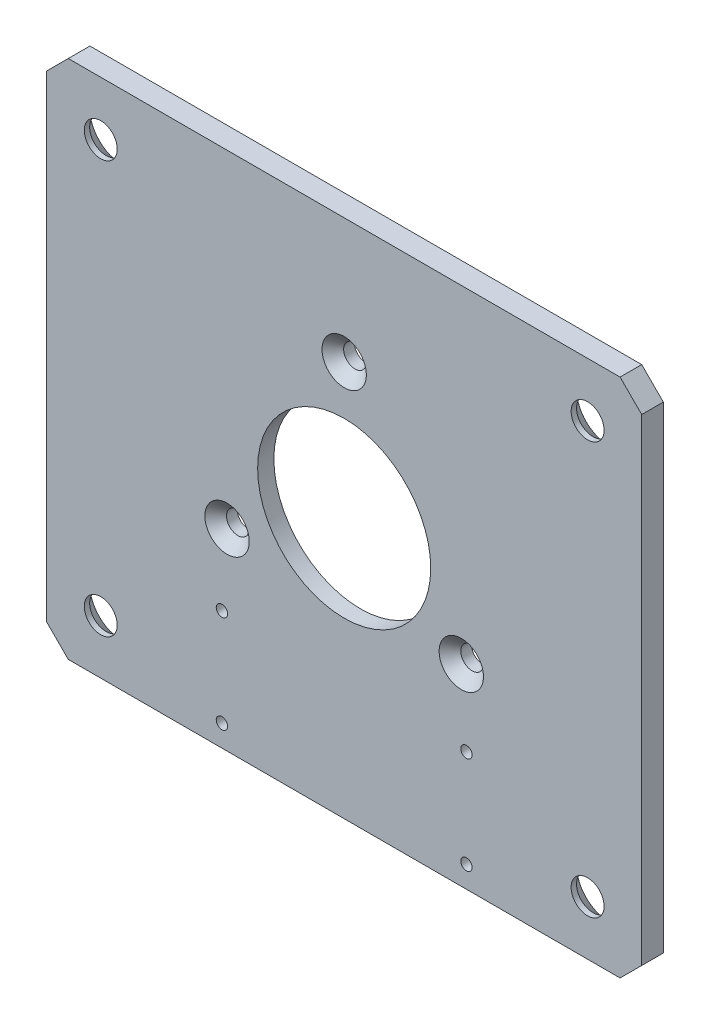
ISO-10303-21;
HEADER;
FILE_DESCRIPTION(('STEP AP214'),'2;1');
FILE_NAME('part.step','',(''),(''),'','','');
FILE_SCHEMA(('AUTOMOTIVE_DESIGN { 1 0 10303 214 1 1 1 1 }'));
ENDSEC;
DATA;
#1=APPLICATION_CONTEXT('core data for automotive mechanical design processes');
#2=APPLICATION_PROTOCOL_DEFINITION('international standard','automotive_design',2000,#1);
#3=PRODUCT_CONTEXT('',#1,'mechanical');
#4=PRODUCT('Part','Part','',(#3));
#5=PRODUCT_RELATED_PRODUCT_CATEGORY('part','',(#4));
#6=PRODUCT_DEFINITION_FORMATION('','',#4);
#7=PRODUCT_DEFINITION_CONTEXT('part definition',#1,'design');
#8=PRODUCT_DEFINITION('design','',#6,#7);
#9=PRODUCT_DEFINITION_SHAPE('','',#8);
#10=(LENGTH_UNIT() NAMED_UNIT(*) SI_UNIT(.MILLI.,.METRE.));
#11=(NAMED_UNIT(*) PLANE_ANGLE_UNIT() SI_UNIT($,.RADIAN.));
#12=(NAMED_UNIT(*) SI_UNIT($,.STERADIAN.) SOLID_ANGLE_UNIT());
#13=UNCERTAINTY_MEASURE_WITH_UNIT(LENGTH_MEASURE(1.E-05),#10,'distance_accuracy_value','');
#14=(GEOMETRIC_REPRESENTATION_CONTEXT(3) GLOBAL_UNCERTAINTY_ASSIGNED_CONTEXT((#13)) GLOBAL_UNIT_ASSIGNED_CONTEXT((#10,
#11,#12)) REPRESENTATION_CONTEXT('',''));
#15=CARTESIAN_POINT('',(0.,0.,0.));
#16=DIRECTION('',(0.,0.,1.));
#17=DIRECTION('',(1.,0.,0.));
#18=AXIS2_PLACEMENT_3D('',#15,#16,#17);
#19=CARTESIAN_POINT('',(0.,0.,2.));
#20=DIRECTION('',(0.,0.,-1.));
#21=DIRECTION('',(-1.,0.,0.));
#22=AXIS2_PLACEMENT_3D('',#19,#20,#21);
#23=CYLINDRICAL_SURFACE('',#22,16.);
#24=CARTESIAN_POINT('',(0.,0.,2.));
#25=DIRECTION('',(0.,0.,1.));
#26=DIRECTION('',(1.,0.,0.));
#27=AXIS2_PLACEMENT_3D('',#24,#25,#26);
#28=CIRCLE('',#27,16.);
#29=CARTESIAN_POINT('',(16.,0.,2.));
#30=VERTEX_POINT('',#29);
#31=EDGE_CURVE('E196',#30,#30,#28,.T.);
#32=ORIENTED_EDGE('',*,*,#31,.T.);
#33=EDGE_LOOP('',(#32));
#34=FACE_BOUND('',#33,.T.);
#35=CARTESIAN_POINT('',(0.,0.,-1.));
#36=DIRECTION('',(0.,0.,-1.));
#37=DIRECTION('',(-1.,0.,0.));
#38=AXIS2_PLACEMENT_3D('',#35,#36,#37);
#39=CIRCLE('',#38,16.);
#40=CARTESIAN_POINT('',(-16.,0.,-1.));
#41=VERTEX_POINT('',#40);
#42=EDGE_CURVE('E193',#41,#41,#39,.T.);
#43=ORIENTED_EDGE('',*,*,#42,.T.);
#44=EDGE_LOOP('',(#43));
#45=FACE_BOUND('',#44,.T.);
#46=ADVANCED_FACE('F37',(#34,#45),#23,.F.);
#47=CARTESIAN_POINT('',(0.,0.,2.));
#48=DIRECTION('',(0.,0.,1.));
#49=DIRECTION('',(1.,0.,0.));
#50=AXIS2_PLACEMENT_3D('',#47,#48,#49);
#51=PLANE('',#50);
#52=CARTESIAN_POINT('',(-22.6,-44.1,2.));
#53=DIRECTION('',(0.,0.,-1.));
#54=DIRECTION('',(-1.,0.,0.));
#55=AXIS2_PLACEMENT_3D('',#52,#53,#54);
#56=CIRCLE('',#55,1.05);
#57=CARTESIAN_POINT('',(-23.65,-44.1,2.));
#58=VERTEX_POINT('',#57);
#59=EDGE_CURVE('E633',#58,#58,#56,.T.);
#60=ORIENTED_EDGE('',*,*,#59,.T.);
#61=EDGE_LOOP('',(#60));
#62=FACE_BOUND('',#61,.T.);
#63=CARTESIAN_POINT('',(-22.6,-26.1,2.));
#64=DIRECTION('',(0.,0.,-1.));
#65=DIRECTION('',(-1.,0.,0.));
#66=AXIS2_PLACEMENT_3D('',#63,#64,#65);
#67=CIRCLE('',#66,1.05);
#68=CARTESIAN_POINT('',(-23.65,-26.1,2.));
#69=VERTEX_POINT('',#68);
#70=EDGE_CURVE('E624',#69,#69,#67,.T.);
#71=ORIENTED_EDGE('',*,*,#70,.T.);
#72=EDGE_LOOP('',(#71));
#73=FACE_BOUND('',#72,.T.);
#74=CARTESIAN_POINT('',(22.6,-26.1,2.));
#75=DIRECTION('',(0.,0.,-1.));
#76=DIRECTION('',(-1.,0.,0.));
#77=AXIS2_PLACEMENT_3D('',#74,#75,#76);
#78=CIRCLE('',#77,1.05);
#79=CARTESIAN_POINT('',(21.55,-26.1,2.));
#80=VERTEX_POINT('',#79);
#81=EDGE_CURVE('E619',#80,#80,#78,.T.);
#82=ORIENTED_EDGE('',*,*,#81,.T.);
#83=EDGE_LOOP('',(#82));
#84=FACE_BOUND('',#83,.T.);
#85=CARTESIAN_POINT('',(22.6,-44.1,2.));
#86=DIRECTION('',(0.,0.,-1.));
#87=DIRECTION('',(-1.,0.,0.));
#88=AXIS2_PLACEMENT_3D('',#85,#86,#87);
#89=CIRCLE('',#88,1.05);
#90=CARTESIAN_POINT('',(21.55,-44.1,2.));
#91=VERTEX_POINT('',#90);
#92=EDGE_CURVE('E384',#91,#91,#89,.T.);
#93=ORIENTED_EDGE('',*,*,#92,.T.);
#94=EDGE_LOOP('',(#93));
#95=FACE_BOUND('',#94,.T.);
#96=CARTESIAN_POINT('',(21.6506350946111,-12.4999999999998,2.));
#97=DIRECTION('',(0.,0.,1.));
#98=DIRECTION('',(1.,0.,0.));
#99=AXIS2_PLACEMENT_3D('',#96,#97,#98);
#100=CIRCLE('',#99,4.09999999999998);
#101=CARTESIAN_POINT('',(25.7506350946111,-12.4999999999998,2.));
#102=VERTEX_POINT('',#101);
#103=EDGE_CURVE('E203',#102,#102,#100,.F.);
#104=ORIENTED_EDGE('',*,*,#103,.T.);
#105=EDGE_LOOP('',(#104));
#106=FACE_BOUND('',#105,.T.);
#107=CARTESIAN_POINT('',(-21.6506350946109,-12.5000000000001,2.));
#108=DIRECTION('',(0.,0.,1.));
#109=DIRECTION('',(1.,0.,0.));
#110=AXIS2_PLACEMENT_3D('',#107,#108,#109);
#111=CIRCLE('',#110,4.10000000000001);
#112=CARTESIAN_POINT('',(-17.5506350946109,-12.5000000000001,2.));
#113=VERTEX_POINT('',#112);
#114=EDGE_CURVE('E200',#113,#113,#111,.F.);
#115=ORIENTED_EDGE('',*,*,#114,.T.);
#116=EDGE_LOOP('',(#115));
#117=FACE_BOUND('',#116,.T.);
#118=CARTESIAN_POINT('',(0.,25.,2.));
#119=DIRECTION('',(0.,0.,1.));
#120=DIRECTION('',(1.,0.,0.));
#121=AXIS2_PLACEMENT_3D('',#118,#119,#120);
#122=CIRCLE('',#121,4.09999999999997);
#123=CARTESIAN_POINT('',(4.09999999999997,25.,2.));
#124=VERTEX_POINT('',#123);
#125=EDGE_CURVE('E192',#124,#124,#122,.F.);
#126=ORIENTED_EDGE('',*,*,#125,.T.);
#127=EDGE_LOOP('',(#126));
#128=FACE_BOUND('',#127,.T.);
#129=CARTESIAN_POINT('',(45.,38.1,2.));
#130=DIRECTION('',(0.,0.,1.));
#131=DIRECTION('',(1.,0.,0.));
#132=AXIS2_PLACEMENT_3D('',#129,#130,#131);
#133=CIRCLE('',#132,3.05);
#134=CARTESIAN_POINT('',(48.05,38.1,2.));
#135=VERTEX_POINT('',#134);
#136=EDGE_CURVE('E230',#135,#135,#133,.T.);
#137=ORIENTED_EDGE('',*,*,#136,.F.);
#138=EDGE_LOOP('',(#137));
#139=FACE_BOUND('',#138,.T.);
#140=CARTESIAN_POINT('',(-45.,-38.1,2.));
#141=DIRECTION('',(0.,0.,1.));
#142=DIRECTION('',(1.,0.,0.));
#143=AXIS2_PLACEMENT_3D('',#140,#141,#142);
#144=CIRCLE('',#143,3.05);
#145=CARTESIAN_POINT('',(-41.95,-38.1,2.));
#146=VERTEX_POINT('',#145);
#147=EDGE_CURVE('E233',#146,#146,#144,.T.);
#148=ORIENTED_EDGE('',*,*,#147,.F.);
#149=EDGE_LOOP('',(#148));
#150=FACE_BOUND('',#149,.T.);
#151=DIRECTION('',(0.,-1.,0.));
#152=VECTOR('',#151,1.);
#153=CARTESIAN_POINT('',(-55.,-48.1,2.));
#154=LINE('',#153,#152);
#155=CARTESIAN_POINT('',(-55.,44.1,2.));
#156=VERTEX_POINT('',#155);
#157=CARTESIAN_POINT('',(-55.,-44.1,2.));
#158=VERTEX_POINT('',#157);
#159=EDGE_CURVE('E142',#156,#158,#154,.T.);
#160=ORIENTED_EDGE('',*,*,#159,.T.);
#161=DIRECTION('',(-0.707106781186546,0.707106781186549,0.));
#162=VECTOR('',#161,1.);
#163=CARTESIAN_POINT('',(-49.5500000000001,-49.5499999999999,2.));
#164=LINE('',#163,#162);
#165=CARTESIAN_POINT('',(-51.,-48.1,2.));
#166=VERTEX_POINT('',#165);
#167=EDGE_CURVE('E157',#158,#166,#164,.F.);
#168=ORIENTED_EDGE('',*,*,#167,.T.);
#169=DIRECTION('',(1.,0.,0.));
#170=VECTOR('',#169,1.);
#171=CARTESIAN_POINT('',(55.,-48.1,2.));
#172=LINE('',#171,#170);
#173=CARTESIAN_POINT('',(51.,-48.1,2.));
#174=VERTEX_POINT('',#173);
#175=EDGE_CURVE('E125',#166,#174,#172,.T.);
#176=ORIENTED_EDGE('',*,*,#175,.T.);
#177=DIRECTION('',(-0.70710678118655,-0.707106781186545,0.));
#178=VECTOR('',#177,1.);
#179=CARTESIAN_POINT('',(49.5499999999998,-49.5500000000002,2.));
#180=LINE('',#179,#178);
#181=CARTESIAN_POINT('',(55.,-44.1,2.));
#182=VERTEX_POINT('',#181);
#183=EDGE_CURVE('E155',#174,#182,#180,.F.);
#184=ORIENTED_EDGE('',*,*,#183,.T.);
#185=DIRECTION('',(0.,1.,0.));
#186=VECTOR('',#185,1.);
#187=CARTESIAN_POINT('',(55.,-48.1,2.));
#188=LINE('',#187,#186);
#189=CARTESIAN_POINT('',(55.,44.1,2.));
#190=VERTEX_POINT('',#189);
#191=EDGE_CURVE('E258',#182,#190,#188,.T.);
#192=ORIENTED_EDGE('',*,*,#191,.T.);
#193=DIRECTION('',(0.707106781186546,-0.707106781186549,0.));
#194=VECTOR('',#193,1.);
#195=CARTESIAN_POINT('',(49.5500000000001,49.5499999999999,2.));
#196=LINE('',#195,#194);
#197=CARTESIAN_POINT('',(51.,48.1,2.));
#198=VERTEX_POINT('',#197);
#199=EDGE_CURVE('E60',#190,#198,#196,.F.);
#200=ORIENTED_EDGE('',*,*,#199,.T.);
#201=DIRECTION('',(-1.,0.,0.));
#202=VECTOR('',#201,1.);
#203=CARTESIAN_POINT('',(55.,48.1,2.));
#204=LINE('',#203,#202);
#205=CARTESIAN_POINT('',(-51.,48.1,2.));
#206=VERTEX_POINT('',#205);
#207=EDGE_CURVE('E143',#198,#206,#204,.T.);
#208=ORIENTED_EDGE('',*,*,#207,.T.);
#209=DIRECTION('',(0.707106781186551,0.707106781186544,0.));
#210=VECTOR('',#209,1.);
#211=CARTESIAN_POINT('',(-49.5499999999998,49.5500000000002,2.));
#212=LINE('',#211,#210);
#213=EDGE_CURVE('E152',#206,#156,#212,.F.);
#214=ORIENTED_EDGE('',*,*,#213,.T.);
#215=EDGE_LOOP('',(#160,#168,#176,#184,#192,#200,#208,#214));
#216=FACE_BOUND('',#215,.T.);
#217=CARTESIAN_POINT('',(-45.,38.1,2.));
#218=DIRECTION('',(0.,0.,1.));
#219=DIRECTION('',(1.,0.,0.));
#220=AXIS2_PLACEMENT_3D('',#217,#218,#219);
#221=CIRCLE('',#220,3.05);
#222=CARTESIAN_POINT('',(-41.95,38.1,2.));
#223=VERTEX_POINT('',#222);
#224=EDGE_CURVE('E137',#223,#223,#221,.T.);
#225=ORIENTED_EDGE('',*,*,#224,.F.);
#226=EDGE_LOOP('',(#225));
#227=FACE_BOUND('',#226,.T.);
#228=CARTESIAN_POINT('',(45.,-38.1,2.));
#229=DIRECTION('',(0.,0.,1.));
#230=DIRECTION('',(1.,0.,0.));
#231=AXIS2_PLACEMENT_3D('',#228,#229,#230);
#232=CIRCLE('',#231,3.05);
#233=CARTESIAN_POINT('',(48.05,-38.1,2.));
#234=VERTEX_POINT('',#233);
#235=EDGE_CURVE('E243',#234,#234,#232,.T.);
#236=ORIENTED_EDGE('',*,*,#235,.F.);
#237=EDGE_LOOP('',(#236));
#238=FACE_BOUND('',#237,.T.);
#239=ORIENTED_EDGE('',*,*,#31,.F.);
#240=EDGE_LOOP('',(#239));
#241=FACE_BOUND('',#240,.T.);
#242=ADVANCED_FACE('F220',(#62,#73,#84,#95,#106,#117,#128,#139,#150,#216,#227,#238,#241),#51,.T.);
#243=CARTESIAN_POINT('',(0.,0.,-2.));
#244=DIRECTION('',(0.,0.,1.));
#245=DIRECTION('',(1.,0.,0.));
#246=AXIS2_PLACEMENT_3D('',#243,#244,#245);
#247=PLANE('',#246);
#248=CARTESIAN_POINT('',(-22.6,-44.1,-2.));
#249=DIRECTION('',(0.,0.,-1.));
#250=DIRECTION('',(-1.,0.,0.));
#251=AXIS2_PLACEMENT_3D('',#248,#249,#250);
#252=CIRCLE('',#251,1.05);
#253=CARTESIAN_POINT('',(-23.65,-44.1,-2.));
#254=VERTEX_POINT('',#253);
#255=EDGE_CURVE('E636',#254,#254,#252,.T.);
#256=ORIENTED_EDGE('',*,*,#255,.F.);
#257=EDGE_LOOP('',(#256));
#258=FACE_BOUND('',#257,.T.);
#259=CARTESIAN_POINT('',(-22.6,-26.1,-2.));
#260=DIRECTION('',(0.,0.,-1.));
#261=DIRECTION('',(-1.,0.,0.));
#262=AXIS2_PLACEMENT_3D('',#259,#260,#261);
#263=CIRCLE('',#262,1.05);
#264=CARTESIAN_POINT('',(-23.65,-26.1,-2.));
#265=VERTEX_POINT('',#264);
#266=EDGE_CURVE('E628',#265,#265,#263,.T.);
#267=ORIENTED_EDGE('',*,*,#266,.F.);
#268=EDGE_LOOP('',(#267));
#269=FACE_BOUND('',#268,.T.);
#270=CARTESIAN_POINT('',(22.6,-26.1,-2.));
#271=DIRECTION('',(0.,0.,-1.));
#272=DIRECTION('',(-1.,0.,0.));
#273=AXIS2_PLACEMENT_3D('',#270,#271,#272);
#274=CIRCLE('',#273,1.05);
#275=CARTESIAN_POINT('',(21.55,-26.1,-2.));
#276=VERTEX_POINT('',#275);
#277=EDGE_CURVE('E622',#276,#276,#274,.T.);
#278=ORIENTED_EDGE('',*,*,#277,.F.);
#279=EDGE_LOOP('',(#278));
#280=FACE_BOUND('',#279,.T.);
#281=CARTESIAN_POINT('',(22.6,-44.1,-2.));
#282=DIRECTION('',(0.,0.,-1.));
#283=DIRECTION('',(-1.,0.,0.));
#284=AXIS2_PLACEMENT_3D('',#281,#282,#283);
#285=CIRCLE('',#284,1.05);
#286=CARTESIAN_POINT('',(21.55,-44.1,-2.));
#287=VERTEX_POINT('',#286);
#288=EDGE_CURVE('E390',#287,#287,#285,.T.);
#289=ORIENTED_EDGE('',*,*,#288,.F.);
#290=EDGE_LOOP('',(#289));
#291=FACE_BOUND('',#290,.T.);
#292=CARTESIAN_POINT('',(-21.6506350946109,-12.5000000000001,-2.));
#293=DIRECTION('',(0.,0.,-1.));
#294=DIRECTION('',(0.500000000000004,-0.866025403784436,0.));
#295=AXIS2_PLACEMENT_3D('',#292,#293,#294);
#296=CIRCLE('',#295,2.1);
#297=CARTESIAN_POINT('',(-20.6006350946109,-14.3186533479474,-2.));
#298=VERTEX_POINT('',#297);
#299=EDGE_CURVE('E383',#298,#298,#296,.T.);
#300=ORIENTED_EDGE('',*,*,#299,.F.);
#301=EDGE_LOOP('',(#300));
#302=FACE_BOUND('',#301,.T.);
#303=CARTESIAN_POINT('',(21.6506350946111,-12.4999999999998,-2.));
#304=DIRECTION('',(0.,0.,-1.));
#305=DIRECTION('',(0.499999999999992,0.866025403784443,0.));
#306=AXIS2_PLACEMENT_3D('',#303,#304,#305);
#307=CIRCLE('',#306,2.1);
#308=CARTESIAN_POINT('',(22.7006350946111,-10.6813466520525,-2.));
#309=VERTEX_POINT('',#308);
#310=EDGE_CURVE('E381',#309,#309,#307,.T.);
#311=ORIENTED_EDGE('',*,*,#310,.F.);
#312=EDGE_LOOP('',(#311));
#313=FACE_BOUND('',#312,.T.);
#314=CARTESIAN_POINT('',(0.,25.,-2.));
#315=DIRECTION('',(0.,0.,-1.));
#316=DIRECTION('',(-1.,0.,0.));
#317=AXIS2_PLACEMENT_3D('',#314,#315,#316);
#318=CIRCLE('',#317,2.1);
#319=CARTESIAN_POINT('',(-2.1,25.,-2.));
#320=VERTEX_POINT('',#319);
#321=EDGE_CURVE('E387',#320,#320,#318,.T.);
#322=ORIENTED_EDGE('',*,*,#321,.F.);
#323=EDGE_LOOP('',(#322));
#324=FACE_BOUND('',#323,.T.);
#325=CARTESIAN_POINT('',(0.,0.,-2.));
#326=DIRECTION('',(0.,0.,-1.));
#327=DIRECTION('',(-1.,0.,0.));
#328=AXIS2_PLACEMENT_3D('',#325,#326,#327);
#329=CIRCLE('',#328,17.5);
#330=CARTESIAN_POINT('',(-17.5,0.,-2.));
#331=VERTEX_POINT('',#330);
#332=EDGE_CURVE('E250',#331,#331,#329,.T.);
#333=ORIENTED_EDGE('',*,*,#332,.F.);
#334=EDGE_LOOP('',(#333));
#335=FACE_BOUND('',#334,.T.);
#336=CARTESIAN_POINT('',(-45.,-38.1,-2.));
#337=DIRECTION('',(0.,0.,1.));
#338=DIRECTION('',(1.,0.,0.));
#339=AXIS2_PLACEMENT_3D('',#336,#337,#338);
#340=CIRCLE('',#339,6.05000000000001);
#341=CARTESIAN_POINT('',(-38.95,-38.1,-2.));
#342=VERTEX_POINT('',#341);
#343=EDGE_CURVE('E177',#342,#342,#340,.T.);
#344=ORIENTED_EDGE('',*,*,#343,.T.);
#345=EDGE_LOOP('',(#344));
#346=FACE_BOUND('',#345,.T.);
#347=CARTESIAN_POINT('',(45.,-38.1,-2.));
#348=DIRECTION('',(0.,0.,1.));
#349=DIRECTION('',(1.,0.,0.));
#350=AXIS2_PLACEMENT_3D('',#347,#348,#349);
#351=CIRCLE('',#350,6.05000000000001);
#352=CARTESIAN_POINT('',(51.05,-38.1,-2.));
#353=VERTEX_POINT('',#352);
#354=EDGE_CURVE('E174',#353,#353,#351,.T.);
#355=ORIENTED_EDGE('',*,*,#354,.T.);
#356=EDGE_LOOP('',(#355));
#357=FACE_BOUND('',#356,.T.);
#358=CARTESIAN_POINT('',(-45.,38.1,-2.));
#359=DIRECTION('',(0.,0.,1.));
#360=DIRECTION('',(1.,0.,0.));
#361=AXIS2_PLACEMENT_3D('',#358,#359,#360);
#362=CIRCLE('',#361,6.05000000000001);
#363=CARTESIAN_POINT('',(-38.95,38.1,-2.));
#364=VERTEX_POINT('',#363);
#365=EDGE_CURVE('E171',#364,#364,#362,.T.);
#366=ORIENTED_EDGE('',*,*,#365,.T.);
#367=EDGE_LOOP('',(#366));
#368=FACE_BOUND('',#367,.T.);
#369=CARTESIAN_POINT('',(45.,38.1,-2.));
#370=DIRECTION('',(0.,0.,1.));
#371=DIRECTION('',(1.,0.,0.));
#372=AXIS2_PLACEMENT_3D('',#369,#370,#371);
#373=CIRCLE('',#372,6.05000000000001);
#374=CARTESIAN_POINT('',(51.05,38.1,-2.));
#375=VERTEX_POINT('',#374);
#376=EDGE_CURVE('E168',#375,#375,#373,.T.);
#377=ORIENTED_EDGE('',*,*,#376,.T.);
#378=EDGE_LOOP('',(#377));
#379=FACE_BOUND('',#378,.T.);
#380=DIRECTION('',(1.,0.,0.));
#381=VECTOR('',#380,1.);
#382=CARTESIAN_POINT('',(55.,-48.1,-2.));
#383=LINE('',#382,#381);
#384=CARTESIAN_POINT('',(-51.,-48.1,-2.));
#385=VERTEX_POINT('',#384);
#386=CARTESIAN_POINT('',(51.,-48.1,-2.));
#387=VERTEX_POINT('',#386);
#388=EDGE_CURVE('E122',#385,#387,#383,.T.);
#389=ORIENTED_EDGE('',*,*,#388,.F.);
#390=DIRECTION('',(0.707106781186546,-0.707106781186549,0.));
#391=VECTOR('',#390,1.);
#392=CARTESIAN_POINT('',(-51.,-48.1,-2.));
#393=LINE('',#392,#391);
#394=CARTESIAN_POINT('',(-55.,-44.1,-2.));
#395=VERTEX_POINT('',#394);
#396=EDGE_CURVE('E105',#385,#395,#393,.F.);
#397=ORIENTED_EDGE('',*,*,#396,.T.);
#398=DIRECTION('',(0.,-1.,0.));
#399=VECTOR('',#398,1.);
#400=CARTESIAN_POINT('',(-55.,-48.1,-2.));
#401=LINE('',#400,#399);
#402=CARTESIAN_POINT('',(-55.,44.1,-2.));
#403=VERTEX_POINT('',#402);
#404=EDGE_CURVE('E132',#403,#395,#401,.T.);
#405=ORIENTED_EDGE('',*,*,#404,.F.);
#406=DIRECTION('',(-0.707106781186551,-0.707106781186544,0.));
#407=VECTOR('',#406,1.);
#408=CARTESIAN_POINT('',(-55.,44.1,-2.));
#409=LINE('',#408,#407);
#410=CARTESIAN_POINT('',(-51.,48.1,-2.));
#411=VERTEX_POINT('',#410);
#412=EDGE_CURVE('E126',#403,#411,#409,.F.);
#413=ORIENTED_EDGE('',*,*,#412,.T.);
#414=DIRECTION('',(-1.,0.,0.));
#415=VECTOR('',#414,1.);
#416=CARTESIAN_POINT('',(55.,48.1,-2.));
#417=LINE('',#416,#415);
#418=CARTESIAN_POINT('',(51.,48.1,-2.));
#419=VERTEX_POINT('',#418);
#420=EDGE_CURVE('E135',#419,#411,#417,.T.);
#421=ORIENTED_EDGE('',*,*,#420,.F.);
#422=DIRECTION('',(-0.707106781186546,0.707106781186549,0.));
#423=VECTOR('',#422,1.);
#424=CARTESIAN_POINT('',(51.,48.1,-2.));
#425=LINE('',#424,#423);
#426=CARTESIAN_POINT('',(55.,44.1,-2.));
#427=VERTEX_POINT('',#426);
#428=EDGE_CURVE('E146',#419,#427,#425,.F.);
#429=ORIENTED_EDGE('',*,*,#428,.T.);
#430=DIRECTION('',(0.,1.,0.));
#431=VECTOR('',#430,1.);
#432=CARTESIAN_POINT('',(55.,-48.1,-2.));
#433=LINE('',#432,#431);
#434=CARTESIAN_POINT('',(55.,-44.1,-2.));
#435=VERTEX_POINT('',#434);
#436=EDGE_CURVE('E131',#435,#427,#433,.T.);
#437=ORIENTED_EDGE('',*,*,#436,.F.);
#438=DIRECTION('',(0.70710678118655,0.707106781186545,0.));
#439=VECTOR('',#438,1.);
#440=CARTESIAN_POINT('',(55.,-44.1,-2.));
#441=LINE('',#440,#439);
#442=EDGE_CURVE('E116',#435,#387,#441,.F.);
#443=ORIENTED_EDGE('',*,*,#442,.T.);
#444=EDGE_LOOP('',(#389,#397,#405,#413,#421,#429,#437,#443));
#445=FACE_BOUND('',#444,.T.);
#446=ADVANCED_FACE('F129',(#258,#269,#280,#291,#302,#313,#324,#335,#346,#357,#368,#379,#445),
#247,.F.);
#447=CARTESIAN_POINT('',(-55.,-48.1,2.));
#448=DIRECTION('',(1.,0.,0.));
#449=DIRECTION('',(0.,0.,-1.));
#450=AXIS2_PLACEMENT_3D('',#447,#448,#449);
#451=PLANE('',#450);
#452=ORIENTED_EDGE('',*,*,#404,.T.);
#453=DIRECTION('',(0.,0.,1.));
#454=VECTOR('',#453,1.);
#455=CARTESIAN_POINT('',(-55.,-44.1,2.));
#456=LINE('',#455,#454);
#457=EDGE_CURVE('E110',#395,#158,#456,.T.);
#458=ORIENTED_EDGE('',*,*,#457,.T.);
#459=ORIENTED_EDGE('',*,*,#159,.F.);
#460=DIRECTION('',(0.,0.,-1.));
#461=VECTOR('',#460,1.);
#462=CARTESIAN_POINT('',(-55.,44.1,2.));
#463=LINE('',#462,#461);
#464=EDGE_CURVE('E115',#156,#403,#463,.T.);
#465=ORIENTED_EDGE('',*,*,#464,.T.);
#466=EDGE_LOOP('',(#452,#458,#459,#465));
#467=FACE_BOUND('',#466,.T.);
#468=ADVANCED_FACE('F265',(#467),#451,.F.);
#469=CARTESIAN_POINT('',(55.,-48.1,2.));
#470=DIRECTION('',(0.,1.,0.));
#471=DIRECTION('',(0.,0.,1.));
#472=AXIS2_PLACEMENT_3D('',#469,#470,#471);
#473=PLANE('',#472);
#474=ORIENTED_EDGE('',*,*,#175,.F.);
#475=DIRECTION('',(0.,0.,-1.));
#476=VECTOR('',#475,1.);
#477=CARTESIAN_POINT('',(-51.,-48.1,2.));
#478=LINE('',#477,#476);
#479=EDGE_CURVE('E109',#166,#385,#478,.T.);
#480=ORIENTED_EDGE('',*,*,#479,.T.);
#481=ORIENTED_EDGE('',*,*,#388,.T.);
#482=DIRECTION('',(0.,0.,1.));
#483=VECTOR('',#482,1.);
#484=CARTESIAN_POINT('',(51.,-48.1,2.));
#485=LINE('',#484,#483);
#486=EDGE_CURVE('E127',#387,#174,#485,.T.);
#487=ORIENTED_EDGE('',*,*,#486,.T.);
#488=EDGE_LOOP('',(#474,#480,#481,#487));
#489=FACE_BOUND('',#488,.T.);
#490=ADVANCED_FACE('F121',(#489),#473,.F.);
#491=CARTESIAN_POINT('',(55.,-48.1,2.));
#492=DIRECTION('',(-1.,0.,0.));
#493=DIRECTION('',(0.,0.,1.));
#494=AXIS2_PLACEMENT_3D('',#491,#492,#493);
#495=PLANE('',#494);
#496=ORIENTED_EDGE('',*,*,#191,.F.);
#497=DIRECTION('',(0.,0.,-1.));
#498=VECTOR('',#497,1.);
#499=CARTESIAN_POINT('',(55.,-44.1,2.));
#500=LINE('',#499,#498);
#501=EDGE_CURVE('E161',#182,#435,#500,.T.);
#502=ORIENTED_EDGE('',*,*,#501,.T.);
#503=ORIENTED_EDGE('',*,*,#436,.T.);
#504=DIRECTION('',(0.,0.,1.));
#505=VECTOR('',#504,1.);
#506=CARTESIAN_POINT('',(55.,44.1,2.));
#507=LINE('',#506,#505);
#508=EDGE_CURVE('E159',#427,#190,#507,.T.);
#509=ORIENTED_EDGE('',*,*,#508,.T.);
#510=EDGE_LOOP('',(#496,#502,#503,#509));
#511=FACE_BOUND('',#510,.T.);
#512=ADVANCED_FACE('F273',(#511),#495,.F.);
#513=CARTESIAN_POINT('',(55.,48.1,2.));
#514=DIRECTION('',(0.,-1.,0.));
#515=DIRECTION('',(0.,0.,-1.));
#516=AXIS2_PLACEMENT_3D('',#513,#514,#515);
#517=PLANE('',#516);
#518=ORIENTED_EDGE('',*,*,#207,.F.);
#519=DIRECTION('',(0.,0.,-1.));
#520=VECTOR('',#519,1.);
#521=CARTESIAN_POINT('',(51.,48.1,2.));
#522=LINE('',#521,#520);
#523=EDGE_CURVE('E165',#198,#419,#522,.T.);
#524=ORIENTED_EDGE('',*,*,#523,.T.);
#525=ORIENTED_EDGE('',*,*,#420,.T.);
#526=DIRECTION('',(0.,0.,1.));
#527=VECTOR('',#526,1.);
#528=CARTESIAN_POINT('',(-51.,48.1,2.));
#529=LINE('',#528,#527);
#530=EDGE_CURVE('E53',#411,#206,#529,.T.);
#531=ORIENTED_EDGE('',*,*,#530,.T.);
#532=EDGE_LOOP('',(#518,#524,#525,#531));
#533=FACE_BOUND('',#532,.T.);
#534=ADVANCED_FACE('F267',(#533),#517,.F.);
#535=CARTESIAN_POINT('',(-45.,38.1,2.));
#536=DIRECTION('',(0.,0.,-1.));
#537=DIRECTION('',(-1.,0.,0.));
#538=AXIS2_PLACEMENT_3D('',#535,#536,#537);
#539=CYLINDRICAL_SURFACE('',#538,3.05);
#540=CARTESIAN_POINT('',(-45.,38.1,1.00000000000004));
#541=DIRECTION('',(0.,0.,1.));
#542=DIRECTION('',(1.,0.,0.));
#543=AXIS2_PLACEMENT_3D('',#540,#541,#542);
#544=CIRCLE('',#543,3.05);
#545=CARTESIAN_POINT('',(-41.95,38.1,1.00000000000004));
#546=VERTEX_POINT('',#545);
#547=EDGE_CURVE('E186',#546,#546,#544,.F.);
#548=ORIENTED_EDGE('',*,*,#547,.T.);
#549=EDGE_LOOP('',(#548));
#550=FACE_BOUND('',#549,.T.);
#551=ORIENTED_EDGE('',*,*,#224,.T.);
#552=EDGE_LOOP('',(#551));
#553=FACE_BOUND('',#552,.T.);
#554=ADVANCED_FACE('F307',(#550,#553),#539,.F.);
#555=CARTESIAN_POINT('',(-45.,-38.1,2.));
#556=DIRECTION('',(0.,0.,-1.));
#557=DIRECTION('',(-1.,0.,0.));
#558=AXIS2_PLACEMENT_3D('',#555,#556,#557);
#559=CYLINDRICAL_SURFACE('',#558,3.05);
#560=CARTESIAN_POINT('',(-45.,-38.1,1.00000000000004));
#561=DIRECTION('',(0.,0.,1.));
#562=DIRECTION('',(1.,0.,0.));
#563=AXIS2_PLACEMENT_3D('',#560,#561,#562);
#564=CIRCLE('',#563,3.05);
#565=CARTESIAN_POINT('',(-41.95,-38.1,1.00000000000004));
#566=VERTEX_POINT('',#565);
#567=EDGE_CURVE('E180',#566,#566,#564,.F.);
#568=ORIENTED_EDGE('',*,*,#567,.T.);
#569=EDGE_LOOP('',(#568));
#570=FACE_BOUND('',#569,.T.);
#571=ORIENTED_EDGE('',*,*,#147,.T.);
#572=EDGE_LOOP('',(#571));
#573=FACE_BOUND('',#572,.T.);
#574=ADVANCED_FACE('F303',(#570,#573),#559,.F.);
#575=CARTESIAN_POINT('',(45.,-38.1,2.));
#576=DIRECTION('',(0.,0.,-1.));
#577=DIRECTION('',(-1.,0.,0.));
#578=AXIS2_PLACEMENT_3D('',#575,#576,#577);
#579=CYLINDRICAL_SURFACE('',#578,3.05);
#580=CARTESIAN_POINT('',(45.,-38.1,1.00000000000004));
#581=DIRECTION('',(0.,0.,1.));
#582=DIRECTION('',(1.,0.,0.));
#583=AXIS2_PLACEMENT_3D('',#580,#581,#582);
#584=CIRCLE('',#583,3.05);
#585=CARTESIAN_POINT('',(48.05,-38.1,1.00000000000004));
#586=VERTEX_POINT('',#585);
#587=EDGE_CURVE('E183',#586,#586,#584,.F.);
#588=ORIENTED_EDGE('',*,*,#587,.T.);
#589=EDGE_LOOP('',(#588));
#590=FACE_BOUND('',#589,.T.);
#591=ORIENTED_EDGE('',*,*,#235,.T.);
#592=EDGE_LOOP('',(#591));
#593=FACE_BOUND('',#592,.T.);
#594=ADVANCED_FACE('F299',(#590,#593),#579,.F.);
#595=CARTESIAN_POINT('',(45.,38.1,2.));
#596=DIRECTION('',(0.,0.,-1.));
#597=DIRECTION('',(-1.,0.,0.));
#598=AXIS2_PLACEMENT_3D('',#595,#596,#597);
#599=CYLINDRICAL_SURFACE('',#598,3.05);
#600=CARTESIAN_POINT('',(45.,38.1,1.00000000000004));
#601=DIRECTION('',(0.,0.,1.));
#602=DIRECTION('',(1.,0.,0.));
#603=AXIS2_PLACEMENT_3D('',#600,#601,#602);
#604=CIRCLE('',#603,3.05);
#605=CARTESIAN_POINT('',(48.05,38.1,1.00000000000004));
#606=VERTEX_POINT('',#605);
#607=EDGE_CURVE('E189',#606,#606,#604,.F.);
#608=ORIENTED_EDGE('',*,*,#607,.T.);
#609=EDGE_LOOP('',(#608));
#610=FACE_BOUND('',#609,.T.);
#611=ORIENTED_EDGE('',*,*,#136,.T.);
#612=EDGE_LOOP('',(#611));
#613=FACE_BOUND('',#612,.T.);
#614=ADVANCED_FACE('F285',(#610,#613),#599,.F.);
#615=CARTESIAN_POINT('',(-51.,-48.1,2.));
#616=DIRECTION('',(0.707106781186549,0.707106781186546,0.));
#617=DIRECTION('',(0.,0.,-1.));
#618=AXIS2_PLACEMENT_3D('',#615,#616,#617);
#619=PLANE('',#618);
#620=ORIENTED_EDGE('',*,*,#167,.F.);
#621=ORIENTED_EDGE('',*,*,#457,.F.);
#622=ORIENTED_EDGE('',*,*,#396,.F.);
#623=ORIENTED_EDGE('',*,*,#479,.F.);
#624=EDGE_LOOP('',(#620,#621,#622,#623));
#625=FACE_BOUND('',#624,.T.);
#626=ADVANCED_FACE('F108',(#625),#619,.F.);
#627=CARTESIAN_POINT('',(55.,-44.1,2.));
#628=DIRECTION('',(-0.707106781186545,0.70710678118655,0.));
#629=DIRECTION('',(0.,0.,-1.));
#630=AXIS2_PLACEMENT_3D('',#627,#628,#629);
#631=PLANE('',#630);
#632=ORIENTED_EDGE('',*,*,#183,.F.);
#633=ORIENTED_EDGE('',*,*,#486,.F.);
#634=ORIENTED_EDGE('',*,*,#442,.F.);
#635=ORIENTED_EDGE('',*,*,#501,.F.);
#636=EDGE_LOOP('',(#632,#633,#634,#635));
#637=FACE_BOUND('',#636,.T.);
#638=ADVANCED_FACE('F277',(#637),#631,.F.);
#639=CARTESIAN_POINT('',(51.,48.1,2.));
#640=DIRECTION('',(-0.707106781186549,-0.707106781186546,0.));
#641=DIRECTION('',(0.,0.,-1.));
#642=AXIS2_PLACEMENT_3D('',#639,#640,#641);
#643=PLANE('',#642);
#644=ORIENTED_EDGE('',*,*,#199,.F.);
#645=ORIENTED_EDGE('',*,*,#508,.F.);
#646=ORIENTED_EDGE('',*,*,#428,.F.);
#647=ORIENTED_EDGE('',*,*,#523,.F.);
#648=EDGE_LOOP('',(#644,#645,#646,#647));
#649=FACE_BOUND('',#648,.T.);
#650=ADVANCED_FACE('F269',(#649),#643,.F.);
#651=CARTESIAN_POINT('',(-55.,44.1,2.));
#652=DIRECTION('',(0.707106781186544,-0.707106781186551,0.));
#653=DIRECTION('',(0.,0.,-1.));
#654=AXIS2_PLACEMENT_3D('',#651,#652,#653);
#655=PLANE('',#654);
#656=ORIENTED_EDGE('',*,*,#213,.F.);
#657=ORIENTED_EDGE('',*,*,#530,.F.);
#658=ORIENTED_EDGE('',*,*,#412,.F.);
#659=ORIENTED_EDGE('',*,*,#464,.F.);
#660=EDGE_LOOP('',(#656,#657,#658,#659));
#661=FACE_BOUND('',#660,.T.);
#662=ADVANCED_FACE('F263',(#661),#655,.F.);
#663=CARTESIAN_POINT('',(-45.,-38.1,-2.));
#664=DIRECTION('',(0.,0.,-1.));
#665=DIRECTION('',(-1.,0.,0.));
#666=AXIS2_PLACEMENT_3D('',#663,#664,#665);
#667=CONICAL_SURFACE('',#666,6.05000000000001,0.785398163397444);
#668=ORIENTED_EDGE('',*,*,#567,.F.);
#669=EDGE_LOOP('',(#668));
#670=FACE_BOUND('',#669,.T.);
#671=ORIENTED_EDGE('',*,*,#343,.F.);
#672=EDGE_LOOP('',(#671));
#673=FACE_BOUND('',#672,.T.);
#674=ADVANCED_FACE('F339',(#670,#673),#667,.F.);
#675=CARTESIAN_POINT('',(45.,-38.1,-2.));
#676=DIRECTION('',(0.,0.,-1.));
#677=DIRECTION('',(-1.,0.,0.));
#678=AXIS2_PLACEMENT_3D('',#675,#676,#677);
#679=CONICAL_SURFACE('',#678,6.05000000000001,0.785398163397444);
#680=ORIENTED_EDGE('',*,*,#587,.F.);
#681=EDGE_LOOP('',(#680));
#682=FACE_BOUND('',#681,.T.);
#683=ORIENTED_EDGE('',*,*,#354,.F.);
#684=EDGE_LOOP('',(#683));
#685=FACE_BOUND('',#684,.T.);
#686=ADVANCED_FACE('F344',(#682,#685),#679,.F.);
#687=CARTESIAN_POINT('',(-45.,38.1,-2.));
#688=DIRECTION('',(0.,0.,-1.));
#689=DIRECTION('',(-1.,0.,0.));
#690=AXIS2_PLACEMENT_3D('',#687,#688,#689);
#691=CONICAL_SURFACE('',#690,6.05000000000001,0.785398163397444);
#692=ORIENTED_EDGE('',*,*,#547,.F.);
#693=EDGE_LOOP('',(#692));
#694=FACE_BOUND('',#693,.T.);
#695=ORIENTED_EDGE('',*,*,#365,.F.);
#696=EDGE_LOOP('',(#695));
#697=FACE_BOUND('',#696,.T.);
#698=ADVANCED_FACE('F349',(#694,#697),#691,.F.);
#699=CARTESIAN_POINT('',(45.,38.1,-2.));
#700=DIRECTION('',(0.,0.,-1.));
#701=DIRECTION('',(-1.,0.,0.));
#702=AXIS2_PLACEMENT_3D('',#699,#700,#701);
#703=CONICAL_SURFACE('',#702,6.05000000000001,0.785398163397444);
#704=ORIENTED_EDGE('',*,*,#607,.F.);
#705=EDGE_LOOP('',(#704));
#706=FACE_BOUND('',#705,.T.);
#707=ORIENTED_EDGE('',*,*,#376,.F.);
#708=EDGE_LOOP('',(#707));
#709=FACE_BOUND('',#708,.T.);
#710=ADVANCED_FACE('F354',(#706,#709),#703,.F.);
#711=CARTESIAN_POINT('',(0.,0.,-1.));
#712=DIRECTION('',(0.,0.,-1.));
#713=DIRECTION('',(-1.,0.,0.));
#714=AXIS2_PLACEMENT_3D('',#711,#712,#713);
#715=CYLINDRICAL_SURFACE('',#714,17.5);
#716=CARTESIAN_POINT('',(0.,0.,-1.));
#717=DIRECTION('',(0.,0.,-1.));
#718=DIRECTION('',(-1.,0.,0.));
#719=AXIS2_PLACEMENT_3D('',#716,#717,#718);
#720=CIRCLE('',#719,17.5);
#721=CARTESIAN_POINT('',(-17.5,0.,-1.));
#722=VERTEX_POINT('',#721);
#723=EDGE_CURVE('E197',#722,#722,#720,.T.);
#724=ORIENTED_EDGE('',*,*,#723,.F.);
#725=EDGE_LOOP('',(#724));
#726=FACE_BOUND('',#725,.T.);
#727=ORIENTED_EDGE('',*,*,#332,.T.);
#728=EDGE_LOOP('',(#727));
#729=FACE_BOUND('',#728,.T.);
#730=ADVANCED_FACE('F295',(#726,#729),#715,.F.);
#731=CARTESIAN_POINT('',(0.,0.,-1.));
#732=DIRECTION('',(0.,0.,-1.));
#733=DIRECTION('',(-1.,0.,0.));
#734=AXIS2_PLACEMENT_3D('',#731,#732,#733);
#735=PLANE('',#734);
#736=ORIENTED_EDGE('',*,*,#42,.F.);
#737=EDGE_LOOP('',(#736));
#738=FACE_BOUND('',#737,.T.);
#739=ORIENTED_EDGE('',*,*,#723,.T.);
#740=EDGE_LOOP('',(#739));
#741=FACE_BOUND('',#740,.T.);
#742=ADVANCED_FACE('F417',(#738,#741),#735,.T.);
#743=CARTESIAN_POINT('',(0.,25.,2.));
#744=DIRECTION('',(0.,0.,-1.));
#745=DIRECTION('',(-1.,0.,0.));
#746=AXIS2_PLACEMENT_3D('',#743,#744,#745);
#747=CYLINDRICAL_SURFACE('',#746,2.1);
#748=CARTESIAN_POINT('',(0.,25.,0.));
#749=DIRECTION('',(0.,0.,1.));
#750=DIRECTION('',(1.,0.,0.));
#751=AXIS2_PLACEMENT_3D('',#748,#749,#750);
#752=CIRCLE('',#751,2.1);
#753=CARTESIAN_POINT('',(2.1,25.,0.));
#754=VERTEX_POINT('',#753);
#755=EDGE_CURVE('E11',#754,#754,#752,.T.);
#756=ORIENTED_EDGE('',*,*,#755,.T.);
#757=EDGE_LOOP('',(#756));
#758=FACE_BOUND('',#757,.T.);
#759=ORIENTED_EDGE('',*,*,#321,.T.);
#760=EDGE_LOOP('',(#759));
#761=FACE_BOUND('',#760,.T.);
#762=ADVANCED_FACE('F377',(#758,#761),#747,.F.);
#763=CARTESIAN_POINT('',(21.6506350946111,-12.4999999999998,2.));
#764=DIRECTION('',(0.,0.,-1.));
#765=DIRECTION('',(-1.,0.,0.));
#766=AXIS2_PLACEMENT_3D('',#763,#764,#765);
#767=CYLINDRICAL_SURFACE('',#766,2.1);
#768=CARTESIAN_POINT('',(21.6506350946111,-12.4999999999998,0.));
#769=DIRECTION('',(0.,0.,1.));
#770=DIRECTION('',(1.,0.,0.));
#771=AXIS2_PLACEMENT_3D('',#768,#769,#770);
#772=CIRCLE('',#771,2.1);
#773=CARTESIAN_POINT('',(23.7506350946111,-12.4999999999998,0.));
#774=VERTEX_POINT('',#773);
#775=EDGE_CURVE('E206',#774,#774,#772,.T.);
#776=ORIENTED_EDGE('',*,*,#775,.T.);
#777=EDGE_LOOP('',(#776));
#778=FACE_BOUND('',#777,.T.);
#779=ORIENTED_EDGE('',*,*,#310,.T.);
#780=EDGE_LOOP('',(#779));
#781=FACE_BOUND('',#780,.T.);
#782=ADVANCED_FACE('F368',(#778,#781),#767,.F.);
#783=CARTESIAN_POINT('',(-21.6506350946109,-12.5000000000001,2.));
#784=DIRECTION('',(0.,0.,-1.));
#785=DIRECTION('',(-1.,0.,0.));
#786=AXIS2_PLACEMENT_3D('',#783,#784,#785);
#787=CYLINDRICAL_SURFACE('',#786,2.1);
#788=CARTESIAN_POINT('',(-21.6506350946109,-12.5000000000001,0.));
#789=DIRECTION('',(0.,0.,1.));
#790=DIRECTION('',(1.,0.,0.));
#791=AXIS2_PLACEMENT_3D('',#788,#789,#790);
#792=CIRCLE('',#791,2.1);
#793=CARTESIAN_POINT('',(-19.5506350946109,-12.5000000000001,0.));
#794=VERTEX_POINT('',#793);
#795=EDGE_CURVE('E46',#794,#794,#792,.T.);
#796=ORIENTED_EDGE('',*,*,#795,.T.);
#797=EDGE_LOOP('',(#796));
#798=FACE_BOUND('',#797,.T.);
#799=ORIENTED_EDGE('',*,*,#299,.T.);
#800=EDGE_LOOP('',(#799));
#801=FACE_BOUND('',#800,.T.);
#802=ADVANCED_FACE('F211',(#798,#801),#787,.F.);
#803=CARTESIAN_POINT('',(21.6506350946111,-12.4999999999998,2.));
#804=DIRECTION('',(0.,0.,1.));
#805=DIRECTION('',(1.,0.,0.));
#806=AXIS2_PLACEMENT_3D('',#803,#804,#805);
#807=CONICAL_SURFACE('',#806,4.09999999999998,0.78539816339745);
#808=ORIENTED_EDGE('',*,*,#775,.F.);
#809=EDGE_LOOP('',(#808));
#810=FACE_BOUND('',#809,.T.);
#811=ORIENTED_EDGE('',*,*,#103,.F.);
#812=EDGE_LOOP('',(#811));
#813=FACE_BOUND('',#812,.T.);
#814=ADVANCED_FACE('F217',(#810,#813),#807,.F.);
#815=CARTESIAN_POINT('',(-21.6506350946109,-12.5000000000001,2.));
#816=DIRECTION('',(0.,0.,1.));
#817=DIRECTION('',(1.,0.,0.));
#818=AXIS2_PLACEMENT_3D('',#815,#816,#817);
#819=CONICAL_SURFACE('',#818,4.10000000000001,0.785398163397444);
#820=ORIENTED_EDGE('',*,*,#795,.F.);
#821=EDGE_LOOP('',(#820));
#822=FACE_BOUND('',#821,.T.);
#823=ORIENTED_EDGE('',*,*,#114,.F.);
#824=EDGE_LOOP('',(#823));
#825=FACE_BOUND('',#824,.T.);
#826=ADVANCED_FACE('F214',(#822,#825),#819,.F.);
#827=CARTESIAN_POINT('',(0.,25.,2.));
#828=DIRECTION('',(0.,0.,1.));
#829=DIRECTION('',(1.,0.,0.));
#830=AXIS2_PLACEMENT_3D('',#827,#828,#829);
#831=CONICAL_SURFACE('',#830,4.09999999999997,0.785398163397447);
#832=ORIENTED_EDGE('',*,*,#755,.F.);
#833=EDGE_LOOP('',(#832));
#834=FACE_BOUND('',#833,.T.);
#835=ORIENTED_EDGE('',*,*,#125,.F.);
#836=EDGE_LOOP('',(#835));
#837=FACE_BOUND('',#836,.T.);
#838=ADVANCED_FACE('F40',(#834,#837),#831,.F.);
#839=CARTESIAN_POINT('',(22.6,-44.1,2.));
#840=DIRECTION('',(0.,0.,-1.));
#841=DIRECTION('',(-1.,0.,0.));
#842=AXIS2_PLACEMENT_3D('',#839,#840,#841);
#843=CYLINDRICAL_SURFACE('',#842,1.05);
#844=ORIENTED_EDGE('',*,*,#92,.F.);
#845=EDGE_LOOP('',(#844));
#846=FACE_BOUND('',#845,.T.);
#847=ORIENTED_EDGE('',*,*,#288,.T.);
#848=EDGE_LOOP('',(#847));
#849=FACE_BOUND('',#848,.T.);
#850=ADVANCED_FACE('F505',(#846,#849),#843,.F.);
#851=CARTESIAN_POINT('',(22.6,-26.1,2.));
#852=DIRECTION('',(0.,0.,-1.));
#853=DIRECTION('',(-1.,0.,0.));
#854=AXIS2_PLACEMENT_3D('',#851,#852,#853);
#855=CYLINDRICAL_SURFACE('',#854,1.05);
#856=ORIENTED_EDGE('',*,*,#81,.F.);
#857=EDGE_LOOP('',(#856));
#858=FACE_BOUND('',#857,.T.);
#859=ORIENTED_EDGE('',*,*,#277,.T.);
#860=EDGE_LOOP('',(#859));
#861=FACE_BOUND('',#860,.T.);
#862=ADVANCED_FACE('F602',(#858,#861),#855,.F.);
#863=CARTESIAN_POINT('',(-22.6,-26.1,2.));
#864=DIRECTION('',(0.,0.,-1.));
#865=DIRECTION('',(-1.,0.,0.));
#866=AXIS2_PLACEMENT_3D('',#863,#864,#865);
#867=CYLINDRICAL_SURFACE('',#866,1.05);
#868=ORIENTED_EDGE('',*,*,#70,.F.);
#869=EDGE_LOOP('',(#868));
#870=FACE_BOUND('',#869,.T.);
#871=ORIENTED_EDGE('',*,*,#266,.T.);
#872=EDGE_LOOP('',(#871));
#873=FACE_BOUND('',#872,.T.);
#874=ADVANCED_FACE('F607',(#870,#873),#867,.F.);
#875=CARTESIAN_POINT('',(-22.6,-44.1,2.));
#876=DIRECTION('',(0.,0.,-1.));
#877=DIRECTION('',(-1.,0.,0.));
#878=AXIS2_PLACEMENT_3D('',#875,#876,#877);
#879=CYLINDRICAL_SURFACE('',#878,1.05);
#880=ORIENTED_EDGE('',*,*,#59,.F.);
#881=EDGE_LOOP('',(#880));
#882=FACE_BOUND('',#881,.T.);
#883=ORIENTED_EDGE('',*,*,#255,.T.);
#884=EDGE_LOOP('',(#883));
#885=FACE_BOUND('',#884,.T.);
#886=ADVANCED_FACE('F604',(#882,#885),#879,.F.);
#887=CLOSED_SHELL('',(#46,#242,#446,#468,#490,#512,#534,#554,#574,#594,#614,#626,#638,#650,#662,
#674,#686,#698,#710,#730,#742,#762,#782,#802,#814,#826,#838,#850,#862,#874,#886));
#888=MANIFOLD_SOLID_BREP('B2',#887);
#889=ADVANCED_BREP_SHAPE_REPRESENTATION('',(#18,#888),#14);
#890=SHAPE_DEFINITION_REPRESENTATION(#9,#889);
ENDSEC;
END-ISO-10303-21;
